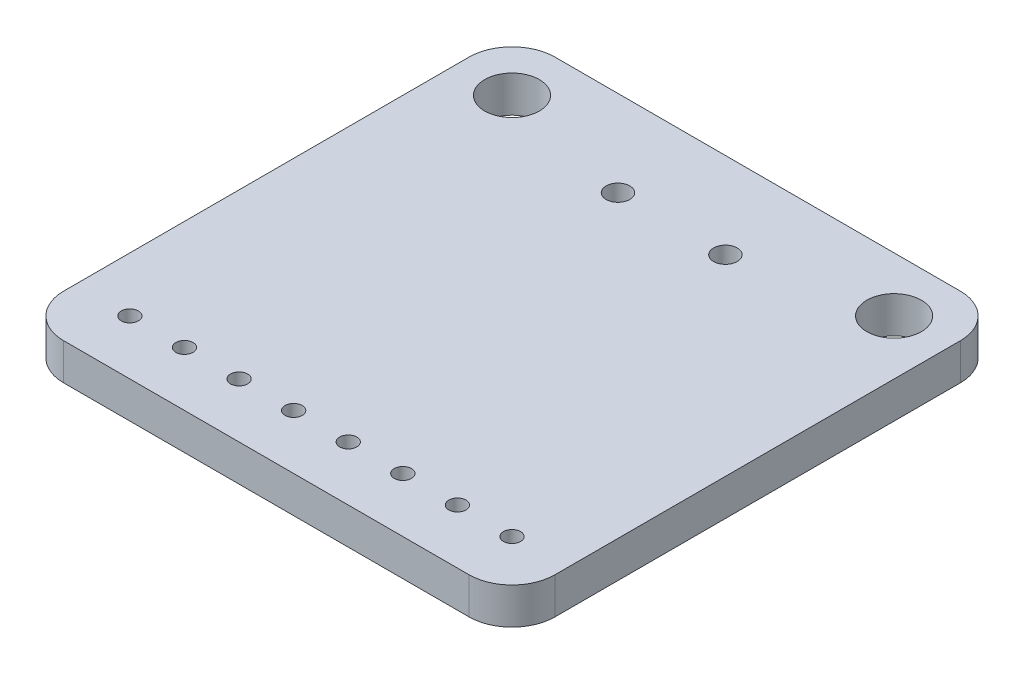
ISO-10303-21;
HEADER;
FILE_DESCRIPTION(('STEP AP214'),'2;1');
FILE_NAME('part.step','',(''),(''),'','','');
FILE_SCHEMA(('AUTOMOTIVE_DESIGN { 1 0 10303 214 1 1 1 1 }'));
ENDSEC;
DATA;
#1=APPLICATION_CONTEXT('core data for automotive mechanical design processes');
#2=APPLICATION_PROTOCOL_DEFINITION('international standard','automotive_design',2000,#1);
#3=PRODUCT_CONTEXT('',#1,'mechanical');
#4=PRODUCT('Part','Part','',(#3));
#5=PRODUCT_RELATED_PRODUCT_CATEGORY('part','',(#4));
#6=PRODUCT_DEFINITION_FORMATION('','',#4);
#7=PRODUCT_DEFINITION_CONTEXT('part definition',#1,'design');
#8=PRODUCT_DEFINITION('design','',#6,#7);
#9=PRODUCT_DEFINITION_SHAPE('','',#8);
#10=(LENGTH_UNIT() NAMED_UNIT(*) SI_UNIT(.MILLI.,.METRE.));
#11=(NAMED_UNIT(*) PLANE_ANGLE_UNIT() SI_UNIT($,.RADIAN.));
#12=(NAMED_UNIT(*) SI_UNIT($,.STERADIAN.) SOLID_ANGLE_UNIT());
#13=UNCERTAINTY_MEASURE_WITH_UNIT(LENGTH_MEASURE(1.E-05),#10,'distance_accuracy_value','');
#14=(GEOMETRIC_REPRESENTATION_CONTEXT(3) GLOBAL_UNCERTAINTY_ASSIGNED_CONTEXT((#13)) GLOBAL_UNIT_ASSIGNED_CONTEXT((#10,
#11,#12)) REPRESENTATION_CONTEXT('',''));
#15=CARTESIAN_POINT('',(0.,0.,0.));
#16=DIRECTION('',(0.,0.,1.));
#17=DIRECTION('',(1.,0.,0.));
#18=AXIS2_PLACEMENT_3D('',#15,#16,#17);
#19=CARTESIAN_POINT('',(10.247636636005,0.,0.512357787518));
#20=DIRECTION('',(0.,1.,0.));
#21=DIRECTION('',(1.,0.,0.));
#22=AXIS2_PLACEMENT_3D('',#19,#20,#21);
#23=PLANE('',#22);
#24=CARTESIAN_POINT('',(8.977636636005,0.,9.402357787519));
#25=DIRECTION('',(0.,1.,0.));
#26=DIRECTION('',(1.,0.,0.));
#27=AXIS2_PLACEMENT_3D('',#24,#25,#26);
#28=CIRCLE('',#27,0.4);
#29=CARTESIAN_POINT('',(9.377636636005,0.,9.402357787519));
#30=VERTEX_POINT('',#29);
#31=EDGE_CURVE('E197',#30,#30,#28,.T.);
#32=ORIENTED_EDGE('',*,*,#31,.T.);
#33=EDGE_LOOP('',(#32));
#34=FACE_BOUND('',#33,.T.);
#35=CARTESIAN_POINT('',(14.057636636005,0.,9.402357787519));
#36=DIRECTION('',(0.,1.,0.));
#37=DIRECTION('',(1.,0.,0.));
#38=AXIS2_PLACEMENT_3D('',#35,#36,#37);
#39=CIRCLE('',#38,0.4);
#40=CARTESIAN_POINT('',(14.457636636005,0.,9.402357787519));
#41=VERTEX_POINT('',#40);
#42=EDGE_CURVE('E207',#41,#41,#39,.T.);
#43=ORIENTED_EDGE('',*,*,#42,.T.);
#44=EDGE_LOOP('',(#43));
#45=FACE_BOUND('',#44,.T.);
#46=CARTESIAN_POINT('',(12.747636636005,0.,-6.917642212482));
#47=DIRECTION('',(0.,1.,0.));
#48=DIRECTION('',(1.,0.,0.));
#49=AXIS2_PLACEMENT_3D('',#46,#47,#48);
#50=CIRCLE('',#49,0.55);
#51=CARTESIAN_POINT('',(13.297636636005,0.,-6.917642212482));
#52=VERTEX_POINT('',#51);
#53=EDGE_CURVE('E233',#52,#52,#50,.T.);
#54=ORIENTED_EDGE('',*,*,#53,.T.);
#55=EDGE_LOOP('',(#54));
#56=FACE_BOUND('',#55,.T.);
#57=CARTESIAN_POINT('',(16.597636636005,0.,9.402357787519));
#58=DIRECTION('',(0.,1.,0.));
#59=DIRECTION('',(1.,0.,0.));
#60=AXIS2_PLACEMENT_3D('',#57,#58,#59);
#61=CIRCLE('',#60,0.4);
#62=CARTESIAN_POINT('',(16.997636636005,0.,9.402357787519));
#63=VERTEX_POINT('',#62);
#64=EDGE_CURVE('E221',#63,#63,#61,.T.);
#65=ORIENTED_EDGE('',*,*,#64,.T.);
#66=EDGE_LOOP('',(#65));
#67=FACE_BOUND('',#66,.T.);
#68=CARTESIAN_POINT('',(3.897636636005,0.,9.402357787519));
#69=DIRECTION('',(0.,1.,0.));
#70=DIRECTION('',(1.,0.,0.));
#71=AXIS2_PLACEMENT_3D('',#68,#69,#70);
#72=CIRCLE('',#71,0.4);
#73=CARTESIAN_POINT('',(4.297636636005,0.,9.402357787519));
#74=VERTEX_POINT('',#73);
#75=EDGE_CURVE('E220',#74,#74,#72,.T.);
#76=ORIENTED_EDGE('',*,*,#75,.T.);
#77=EDGE_LOOP('',(#76));
#78=FACE_BOUND('',#77,.T.);
#79=CARTESIAN_POINT('',(6.437636636005,0.,9.402357787519));
#80=DIRECTION('',(0.,1.,0.));
#81=DIRECTION('',(1.,0.,0.));
#82=AXIS2_PLACEMENT_3D('',#79,#80,#81);
#83=CIRCLE('',#82,0.4);
#84=CARTESIAN_POINT('',(6.837636636005,0.,9.402357787519));
#85=VERTEX_POINT('',#84);
#86=EDGE_CURVE('E216',#85,#85,#83,.T.);
#87=ORIENTED_EDGE('',*,*,#86,.T.);
#88=EDGE_LOOP('',(#87));
#89=FACE_BOUND('',#88,.T.);
#90=CARTESIAN_POINT('',(19.137636636005,0.,-8.377642212482));
#91=DIRECTION('',(0.,1.,0.));
#92=DIRECTION('',(1.,0.,0.));
#93=AXIS2_PLACEMENT_3D('',#90,#91,#92);
#94=CIRCLE('',#93,1.27);
#95=CARTESIAN_POINT('',(20.407636636005,0.,-8.377642212482));
#96=VERTEX_POINT('',#95);
#97=EDGE_CURVE('E215',#96,#96,#94,.T.);
#98=ORIENTED_EDGE('',*,*,#97,.T.);
#99=EDGE_LOOP('',(#98));
#100=FACE_BOUND('',#99,.T.);
#101=CARTESIAN_POINT('',(1.357636636005,0.,-8.377642212482));
#102=DIRECTION('',(0.,1.,0.));
#103=DIRECTION('',(1.,0.,0.));
#104=AXIS2_PLACEMENT_3D('',#101,#102,#103);
#105=CIRCLE('',#104,1.27);
#106=CARTESIAN_POINT('',(2.627636636005,0.,-8.377642212482));
#107=VERTEX_POINT('',#106);
#108=EDGE_CURVE('E211',#107,#107,#105,.T.);
#109=ORIENTED_EDGE('',*,*,#108,.T.);
#110=EDGE_LOOP('',(#109));
#111=FACE_BOUND('',#110,.T.);
#112=CARTESIAN_POINT('',(11.517636636005,0.,9.402357787519));
#113=DIRECTION('',(0.,1.,0.));
#114=DIRECTION('',(1.,0.,0.));
#115=AXIS2_PLACEMENT_3D('',#112,#113,#114);
#116=CIRCLE('',#115,0.4);
#117=CARTESIAN_POINT('',(11.917636636005,0.,9.402357787519));
#118=VERTEX_POINT('',#117);
#119=EDGE_CURVE('E247',#118,#118,#116,.T.);
#120=ORIENTED_EDGE('',*,*,#119,.T.);
#121=EDGE_LOOP('',(#120));
#122=FACE_BOUND('',#121,.T.);
#123=CARTESIAN_POINT('',(19.137636636005,0.,9.402357787519));
#124=DIRECTION('',(0.,1.,0.));
#125=DIRECTION('',(1.,0.,0.));
#126=AXIS2_PLACEMENT_3D('',#123,#124,#125);
#127=CIRCLE('',#126,0.4);
#128=CARTESIAN_POINT('',(19.537636636005,0.,9.402357787519));
#129=VERTEX_POINT('',#128);
#130=EDGE_CURVE('E246',#129,#129,#127,.T.);
#131=ORIENTED_EDGE('',*,*,#130,.T.);
#132=EDGE_LOOP('',(#131));
#133=FACE_BOUND('',#132,.T.);
#134=CARTESIAN_POINT('',(1.357636636005,0.,9.402357787519));
#135=DIRECTION('',(0.,1.,0.));
#136=DIRECTION('',(1.,0.,0.));
#137=AXIS2_PLACEMENT_3D('',#134,#135,#136);
#138=CIRCLE('',#137,0.4);
#139=CARTESIAN_POINT('',(1.757636636005,0.,9.402357787519));
#140=VERTEX_POINT('',#139);
#141=EDGE_CURVE('E291',#140,#140,#138,.T.);
#142=ORIENTED_EDGE('',*,*,#141,.T.);
#143=EDGE_LOOP('',(#142));
#144=FACE_BOUND('',#143,.T.);
#145=CARTESIAN_POINT('',(7.747636636005,0.,-6.917642212482));
#146=DIRECTION('',(0.,1.,0.));
#147=DIRECTION('',(1.,0.,0.));
#148=AXIS2_PLACEMENT_3D('',#145,#146,#147);
#149=CIRCLE('',#148,0.55);
#150=CARTESIAN_POINT('',(8.297636636005,0.,-6.917642212482));
#151=VERTEX_POINT('',#150);
#152=EDGE_CURVE('E272',#151,#151,#149,.T.);
#153=ORIENTED_EDGE('',*,*,#152,.T.);
#154=EDGE_LOOP('',(#153));
#155=FACE_BOUND('',#154,.T.);
#156=CARTESIAN_POINT('',(0.817636636009,0.,-8.917642212479));
#157=DIRECTION('',(0.,-1.,0.));
#158=DIRECTION('',(0.,0.,-1.));
#159=AXIS2_PLACEMENT_3D('',#156,#157,#158);
#160=CIRCLE('',#159,2.000000000003);
#161=CARTESIAN_POINT('',(-1.182363363994,0.,-8.917642212479));
#162=VERTEX_POINT('',#161);
#163=CARTESIAN_POINT('',(0.817636636009,0.,-10.91764221248));
#164=VERTEX_POINT('',#163);
#165=EDGE_CURVE('E11',#162,#164,#160,.T.);
#166=ORIENTED_EDGE('',*,*,#165,.T.);
#167=DIRECTION('',(1.,0.,0.));
#168=VECTOR('',#167,1.);
#169=CARTESIAN_POINT('',(0.817636636009,0.,-10.91764221248));
#170=LINE('',#169,#168);
#171=CARTESIAN_POINT('',(19.677636636006,0.,-10.91764221248));
#172=VERTEX_POINT('',#171);
#173=EDGE_CURVE('E345',#164,#172,#170,.T.);
#174=ORIENTED_EDGE('',*,*,#173,.T.);
#175=CARTESIAN_POINT('',(19.677636636004,0.,-8.917642212482));
#176=DIRECTION('',(0.,-1.,0.));
#177=DIRECTION('',(1.,0.,0.));
#178=AXIS2_PLACEMENT_3D('',#175,#176,#177);
#179=CIRCLE('',#178,2.);
#180=CARTESIAN_POINT('',(21.677636636004,0.,-8.917642212482));
#181=VERTEX_POINT('',#180);
#182=EDGE_CURVE('E262',#172,#181,#179,.T.);
#183=ORIENTED_EDGE('',*,*,#182,.T.);
#184=DIRECTION('',(0.,0.,1.));
#185=VECTOR('',#184,1.);
#186=CARTESIAN_POINT('',(21.677636636004,0.,-8.917642212482));
#187=LINE('',#186,#185);
#188=CARTESIAN_POINT('',(21.677636636004,0.,9.942357787519));
#189=VERTEX_POINT('',#188);
#190=EDGE_CURVE('E239',#181,#189,#187,.T.);
#191=ORIENTED_EDGE('',*,*,#190,.T.);
#192=CARTESIAN_POINT('',(19.677636636005,0.,9.942357787519));
#193=DIRECTION('',(0.,-1.,0.));
#194=DIRECTION('',(0.,0.,1.));
#195=AXIS2_PLACEMENT_3D('',#192,#193,#194);
#196=CIRCLE('',#195,1.999999999999);
#197=CARTESIAN_POINT('',(19.677636636005,0.,11.942357787518));
#198=VERTEX_POINT('',#197);
#199=EDGE_CURVE('E297',#189,#198,#196,.T.);
#200=ORIENTED_EDGE('',*,*,#199,.T.);
#201=DIRECTION('',(-1.,0.,0.));
#202=VECTOR('',#201,1.);
#203=CARTESIAN_POINT('',(19.677636636005,0.,11.942357787518));
#204=LINE('',#203,#202);
#205=CARTESIAN_POINT('',(0.817636636006,0.,11.942357787518));
#206=VERTEX_POINT('',#205);
#207=EDGE_CURVE('E324',#198,#206,#204,.T.);
#208=ORIENTED_EDGE('',*,*,#207,.T.);
#209=CARTESIAN_POINT('',(0.817636636006,0.,9.942357787518));
#210=DIRECTION('',(0.,-1.,0.));
#211=DIRECTION('',(-1.,0.,0.));
#212=AXIS2_PLACEMENT_3D('',#209,#210,#211);
#213=CIRCLE('',#212,2.);
#214=CARTESIAN_POINT('',(-1.182363363994,0.,9.942357787518));
#215=VERTEX_POINT('',#214);
#216=EDGE_CURVE('E285',#206,#215,#213,.T.);
#217=ORIENTED_EDGE('',*,*,#216,.T.);
#218=DIRECTION('',(0.,0.,-1.));
#219=VECTOR('',#218,1.);
#220=CARTESIAN_POINT('',(-1.182363363994,0.,9.942357787518));
#221=LINE('',#220,#219);
#222=EDGE_CURVE('E229',#215,#162,#221,.T.);
#223=ORIENTED_EDGE('',*,*,#222,.T.);
#224=EDGE_LOOP('',(#166,#174,#183,#191,#200,#208,#217,#223));
#225=FACE_BOUND('',#224,.T.);
#226=ADVANCED_FACE('F17',(#34,#45,#56,#67,#78,#89,#100,#111,#122,#133,#144,#155,#225),#23,.F.);
#227=CARTESIAN_POINT('',(10.247636636005,1.7,0.512357787518));
#228=DIRECTION('',(0.,1.,0.));
#229=DIRECTION('',(1.,0.,0.));
#230=AXIS2_PLACEMENT_3D('',#227,#228,#229);
#231=PLANE('',#230);
#232=CARTESIAN_POINT('',(8.977636636005,1.7,9.402357787519));
#233=DIRECTION('',(0.,-1.,0.));
#234=DIRECTION('',(1.,0.,0.));
#235=AXIS2_PLACEMENT_3D('',#232,#233,#234);
#236=CIRCLE('',#235,0.4);
#237=CARTESIAN_POINT('',(9.377636636005,1.7,9.402357787519));
#238=VERTEX_POINT('',#237);
#239=EDGE_CURVE('E201',#238,#238,#236,.T.);
#240=ORIENTED_EDGE('',*,*,#239,.T.);
#241=EDGE_LOOP('',(#240));
#242=FACE_BOUND('',#241,.T.);
#243=CARTESIAN_POINT('',(14.057636636005,1.7,9.402357787519));
#244=DIRECTION('',(0.,-1.,0.));
#245=DIRECTION('',(1.,0.,0.));
#246=AXIS2_PLACEMENT_3D('',#243,#244,#245);
#247=CIRCLE('',#246,0.4);
#248=CARTESIAN_POINT('',(14.457636636005,1.7,9.402357787519));
#249=VERTEX_POINT('',#248);
#250=EDGE_CURVE('E224',#249,#249,#247,.T.);
#251=ORIENTED_EDGE('',*,*,#250,.T.);
#252=EDGE_LOOP('',(#251));
#253=FACE_BOUND('',#252,.T.);
#254=CARTESIAN_POINT('',(12.747636636005,1.7,-6.917642212482));
#255=DIRECTION('',(0.,-1.,0.));
#256=DIRECTION('',(1.,0.,0.));
#257=AXIS2_PLACEMENT_3D('',#254,#255,#256);
#258=CIRCLE('',#257,0.55);
#259=CARTESIAN_POINT('',(13.297636636005,1.7,-6.917642212482));
#260=VERTEX_POINT('',#259);
#261=EDGE_CURVE('E250',#260,#260,#258,.T.);
#262=ORIENTED_EDGE('',*,*,#261,.T.);
#263=EDGE_LOOP('',(#262));
#264=FACE_BOUND('',#263,.T.);
#265=CARTESIAN_POINT('',(16.597636636005,1.7,9.402357787519));
#266=DIRECTION('',(0.,-1.,0.));
#267=DIRECTION('',(1.,0.,0.));
#268=AXIS2_PLACEMENT_3D('',#265,#266,#267);
#269=CIRCLE('',#268,0.4);
#270=CARTESIAN_POINT('',(16.997636636005,1.7,9.402357787519));
#271=VERTEX_POINT('',#270);
#272=EDGE_CURVE('E217',#271,#271,#269,.T.);
#273=ORIENTED_EDGE('',*,*,#272,.T.);
#274=EDGE_LOOP('',(#273));
#275=FACE_BOUND('',#274,.T.);
#276=CARTESIAN_POINT('',(3.897636636005,1.7,9.402357787519));
#277=DIRECTION('',(0.,-1.,0.));
#278=DIRECTION('',(1.,0.,0.));
#279=AXIS2_PLACEMENT_3D('',#276,#277,#278);
#280=CIRCLE('',#279,0.4);
#281=CARTESIAN_POINT('',(4.297636636005,1.7,9.402357787519));
#282=VERTEX_POINT('',#281);
#283=EDGE_CURVE('E242',#282,#282,#280,.T.);
#284=ORIENTED_EDGE('',*,*,#283,.T.);
#285=EDGE_LOOP('',(#284));
#286=FACE_BOUND('',#285,.T.);
#287=CARTESIAN_POINT('',(6.437636636005,1.7,9.402357787519));
#288=DIRECTION('',(0.,-1.,0.));
#289=DIRECTION('',(1.,0.,0.));
#290=AXIS2_PLACEMENT_3D('',#287,#288,#289);
#291=CIRCLE('',#290,0.4);
#292=CARTESIAN_POINT('',(6.837636636005,1.7,9.402357787519));
#293=VERTEX_POINT('',#292);
#294=EDGE_CURVE('E212',#293,#293,#291,.T.);
#295=ORIENTED_EDGE('',*,*,#294,.T.);
#296=EDGE_LOOP('',(#295));
#297=FACE_BOUND('',#296,.T.);
#298=CARTESIAN_POINT('',(19.137636636005,1.7,-8.377642212482));
#299=DIRECTION('',(0.,-1.,0.));
#300=DIRECTION('',(1.,0.,0.));
#301=AXIS2_PLACEMENT_3D('',#298,#299,#300);
#302=CIRCLE('',#301,1.27);
#303=CARTESIAN_POINT('',(20.407636636005,1.7,-8.377642212482));
#304=VERTEX_POINT('',#303);
#305=EDGE_CURVE('E267',#304,#304,#302,.T.);
#306=ORIENTED_EDGE('',*,*,#305,.T.);
#307=EDGE_LOOP('',(#306));
#308=FACE_BOUND('',#307,.T.);
#309=CARTESIAN_POINT('',(1.357636636005,1.7,-8.377642212482));
#310=DIRECTION('',(0.,-1.,0.));
#311=DIRECTION('',(1.,0.,0.));
#312=AXIS2_PLACEMENT_3D('',#309,#310,#311);
#313=CIRCLE('',#312,1.27);
#314=CARTESIAN_POINT('',(2.627636636005,1.7,-8.377642212482));
#315=VERTEX_POINT('',#314);
#316=EDGE_CURVE('E275',#315,#315,#313,.T.);
#317=ORIENTED_EDGE('',*,*,#316,.T.);
#318=EDGE_LOOP('',(#317));
#319=FACE_BOUND('',#318,.T.);
#320=CARTESIAN_POINT('',(11.517636636005,1.7,9.402357787519));
#321=DIRECTION('',(0.,-1.,0.));
#322=DIRECTION('',(1.,0.,0.));
#323=AXIS2_PLACEMENT_3D('',#320,#321,#322);
#324=CIRCLE('',#323,0.4);
#325=CARTESIAN_POINT('',(11.917636636005,1.7,9.402357787519));
#326=VERTEX_POINT('',#325);
#327=EDGE_CURVE('E243',#326,#326,#324,.T.);
#328=ORIENTED_EDGE('',*,*,#327,.T.);
#329=EDGE_LOOP('',(#328));
#330=FACE_BOUND('',#329,.T.);
#331=CARTESIAN_POINT('',(19.137636636005,1.7,9.402357787519));
#332=DIRECTION('',(0.,-1.,0.));
#333=DIRECTION('',(1.,0.,0.));
#334=AXIS2_PLACEMENT_3D('',#331,#332,#333);
#335=CIRCLE('',#334,0.4);
#336=CARTESIAN_POINT('',(19.537636636005,1.7,9.402357787519));
#337=VERTEX_POINT('',#336);
#338=EDGE_CURVE('E288',#337,#337,#335,.T.);
#339=ORIENTED_EDGE('',*,*,#338,.T.);
#340=EDGE_LOOP('',(#339));
#341=FACE_BOUND('',#340,.T.);
#342=CARTESIAN_POINT('',(1.357636636005,1.7,9.402357787519));
#343=DIRECTION('',(0.,-1.,0.));
#344=DIRECTION('',(1.,0.,0.));
#345=AXIS2_PLACEMENT_3D('',#342,#343,#344);
#346=CIRCLE('',#345,0.4);
#347=CARTESIAN_POINT('',(1.757636636005,1.7,9.402357787519));
#348=VERTEX_POINT('',#347);
#349=EDGE_CURVE('E303',#348,#348,#346,.T.);
#350=ORIENTED_EDGE('',*,*,#349,.T.);
#351=EDGE_LOOP('',(#350));
#352=FACE_BOUND('',#351,.T.);
#353=CARTESIAN_POINT('',(7.747636636005,1.7,-6.917642212482));
#354=DIRECTION('',(0.,-1.,0.));
#355=DIRECTION('',(1.,0.,0.));
#356=AXIS2_PLACEMENT_3D('',#353,#354,#355);
#357=CIRCLE('',#356,0.55);
#358=CARTESIAN_POINT('',(8.297636636005,1.7,-6.917642212482));
#359=VERTEX_POINT('',#358);
#360=EDGE_CURVE('E268',#359,#359,#357,.T.);
#361=ORIENTED_EDGE('',*,*,#360,.T.);
#362=EDGE_LOOP('',(#361));
#363=FACE_BOUND('',#362,.T.);
#364=CARTESIAN_POINT('',(0.817636636009,1.7,-8.917642212479));
#365=DIRECTION('',(0.,1.,0.));
#366=DIRECTION('',(0.,0.,-1.));
#367=AXIS2_PLACEMENT_3D('',#364,#365,#366);
#368=CIRCLE('',#367,2.000000000003);
#369=CARTESIAN_POINT('',(0.817636636009,1.7,-10.91764221248));
#370=VERTEX_POINT('',#369);
#371=CARTESIAN_POINT('',(-1.182363363994,1.7,-8.917642212479));
#372=VERTEX_POINT('',#371);
#373=EDGE_CURVE('E20',#370,#372,#368,.T.);
#374=ORIENTED_EDGE('',*,*,#373,.T.);
#375=DIRECTION('',(0.,0.,-1.));
#376=VECTOR('',#375,1.);
#377=CARTESIAN_POINT('',(-1.182363363994,1.7,9.942357787518));
#378=LINE('',#377,#376);
#379=CARTESIAN_POINT('',(-1.182363363994,1.7,9.942357787518));
#380=VERTEX_POINT('',#379);
#381=EDGE_CURVE('E271',#380,#372,#378,.T.);
#382=ORIENTED_EDGE('',*,*,#381,.F.);
#383=CARTESIAN_POINT('',(0.817636636006,1.7,9.942357787518));
#384=DIRECTION('',(0.,1.,0.));
#385=DIRECTION('',(-1.,0.,0.));
#386=AXIS2_PLACEMENT_3D('',#383,#384,#385);
#387=CIRCLE('',#386,2.);
#388=CARTESIAN_POINT('',(0.817636636006,1.7,11.942357787518));
#389=VERTEX_POINT('',#388);
#390=EDGE_CURVE('E228',#380,#389,#387,.T.);
#391=ORIENTED_EDGE('',*,*,#390,.T.);
#392=DIRECTION('',(-1.,0.,0.));
#393=VECTOR('',#392,1.);
#394=CARTESIAN_POINT('',(19.677636636005,1.7,11.942357787518));
#395=LINE('',#394,#393);
#396=CARTESIAN_POINT('',(19.677636636005,1.7,11.942357787518));
#397=VERTEX_POINT('',#396);
#398=EDGE_CURVE('E284',#397,#389,#395,.T.);
#399=ORIENTED_EDGE('',*,*,#398,.F.);
#400=CARTESIAN_POINT('',(19.677636636005,1.7,9.942357787519));
#401=DIRECTION('',(0.,1.,0.));
#402=DIRECTION('',(0.,0.,1.));
#403=AXIS2_PLACEMENT_3D('',#400,#401,#402);
#404=CIRCLE('',#403,1.999999999999);
#405=CARTESIAN_POINT('',(21.677636636004,1.7,9.942357787519));
#406=VERTEX_POINT('',#405);
#407=EDGE_CURVE('E300',#397,#406,#404,.T.);
#408=ORIENTED_EDGE('',*,*,#407,.T.);
#409=DIRECTION('',(0.,0.,1.));
#410=VECTOR('',#409,1.);
#411=CARTESIAN_POINT('',(21.677636636004,1.7,-8.917642212482));
#412=LINE('',#411,#410);
#413=CARTESIAN_POINT('',(21.677636636004,1.7,-8.917642212482));
#414=VERTEX_POINT('',#413);
#415=EDGE_CURVE('E296',#414,#406,#412,.T.);
#416=ORIENTED_EDGE('',*,*,#415,.F.);
#417=CARTESIAN_POINT('',(19.677636636004,1.7,-8.917642212482));
#418=DIRECTION('',(0.,1.,0.));
#419=DIRECTION('',(1.,0.,0.));
#420=AXIS2_PLACEMENT_3D('',#417,#418,#419);
#421=CIRCLE('',#420,2.);
#422=CARTESIAN_POINT('',(19.677636636006,1.7,-10.91764221248));
#423=VERTEX_POINT('',#422);
#424=EDGE_CURVE('E238',#414,#423,#421,.T.);
#425=ORIENTED_EDGE('',*,*,#424,.T.);
#426=DIRECTION('',(1.,0.,0.));
#427=VECTOR('',#426,1.);
#428=CARTESIAN_POINT('',(0.817636636009,1.7,-10.91764221248));
#429=LINE('',#428,#427);
#430=EDGE_CURVE('E261',#370,#423,#429,.T.);
#431=ORIENTED_EDGE('',*,*,#430,.F.);
#432=EDGE_LOOP('',(#374,#382,#391,#399,#408,#416,#425,#431));
#433=FACE_BOUND('',#432,.T.);
#434=ADVANCED_FACE('F358',(#242,#253,#264,#275,#286,#297,#308,#319,#330,#341,#352,#363,#433),
#231,.T.);
#435=CARTESIAN_POINT('',(0.817636636009,1.7,-8.917642212479));
#436=DIRECTION('',(0.,-1.,0.));
#437=DIRECTION('',(0.,0.,-1.));
#438=AXIS2_PLACEMENT_3D('',#435,#436,#437);
#439=CYLINDRICAL_SURFACE('',#438,2.000000000003);
#440=ORIENTED_EDGE('',*,*,#373,.F.);
#441=DIRECTION('',(0.,-1.,0.));
#442=VECTOR('',#441,1.);
#443=CARTESIAN_POINT('',(0.817636636009,1.7,-10.91764221248));
#444=LINE('',#443,#442);
#445=EDGE_CURVE('E347',#370,#164,#444,.T.);
#446=ORIENTED_EDGE('',*,*,#445,.T.);
#447=ORIENTED_EDGE('',*,*,#165,.F.);
#448=DIRECTION('',(0.,-1.,0.));
#449=VECTOR('',#448,1.);
#450=CARTESIAN_POINT('',(-1.182363363994,1.7,-8.917642212479));
#451=LINE('',#450,#449);
#452=EDGE_CURVE('E311',#372,#162,#451,.T.);
#453=ORIENTED_EDGE('',*,*,#452,.F.);
#454=EDGE_LOOP('',(#440,#446,#447,#453));
#455=FACE_BOUND('',#454,.T.);
#456=ADVANCED_FACE('F359',(#455),#439,.T.);
#457=CARTESIAN_POINT('',(0.817636636009,1.7,-10.91764221248));
#458=DIRECTION('',(0.,0.,-1.));
#459=DIRECTION('',(0.,-1.,0.));
#460=AXIS2_PLACEMENT_3D('',#457,#458,#459);
#461=PLANE('',#460);
#462=ORIENTED_EDGE('',*,*,#430,.T.);
#463=DIRECTION('',(0.,-1.,0.));
#464=VECTOR('',#463,1.);
#465=CARTESIAN_POINT('',(19.677636636006,1.7,-10.91764221248));
#466=LINE('',#465,#464);
#467=EDGE_CURVE('E257',#423,#172,#466,.T.);
#468=ORIENTED_EDGE('',*,*,#467,.T.);
#469=ORIENTED_EDGE('',*,*,#173,.F.);
#470=ORIENTED_EDGE('',*,*,#445,.F.);
#471=EDGE_LOOP('',(#462,#468,#469,#470));
#472=FACE_BOUND('',#471,.T.);
#473=ADVANCED_FACE('F387',(#472),#461,.T.);
#474=CARTESIAN_POINT('',(19.677636636004,1.7,-8.917642212482));
#475=DIRECTION('',(0.,-1.,0.));
#476=DIRECTION('',(1.,0.,0.));
#477=AXIS2_PLACEMENT_3D('',#474,#475,#476);
#478=CYLINDRICAL_SURFACE('',#477,2.);
#479=ORIENTED_EDGE('',*,*,#424,.F.);
#480=DIRECTION('',(0.,-1.,0.));
#481=VECTOR('',#480,1.);
#482=CARTESIAN_POINT('',(21.677636636004,1.7,-8.917642212482));
#483=LINE('',#482,#481);
#484=EDGE_CURVE('E234',#414,#181,#483,.T.);
#485=ORIENTED_EDGE('',*,*,#484,.T.);
#486=ORIENTED_EDGE('',*,*,#182,.F.);
#487=ORIENTED_EDGE('',*,*,#467,.F.);
#488=EDGE_LOOP('',(#479,#485,#486,#487));
#489=FACE_BOUND('',#488,.T.);
#490=ADVANCED_FACE('F384',(#489),#478,.T.);
#491=CARTESIAN_POINT('',(21.677636636004,1.7,-8.917642212482));
#492=DIRECTION('',(1.,0.,0.));
#493=DIRECTION('',(0.,1.,0.));
#494=AXIS2_PLACEMENT_3D('',#491,#492,#493);
#495=PLANE('',#494);
#496=ORIENTED_EDGE('',*,*,#415,.T.);
#497=DIRECTION('',(0.,-1.,0.));
#498=VECTOR('',#497,1.);
#499=CARTESIAN_POINT('',(21.677636636004,1.7,9.942357787519));
#500=LINE('',#499,#498);
#501=EDGE_CURVE('E292',#406,#189,#500,.T.);
#502=ORIENTED_EDGE('',*,*,#501,.T.);
#503=ORIENTED_EDGE('',*,*,#190,.F.);
#504=ORIENTED_EDGE('',*,*,#484,.F.);
#505=EDGE_LOOP('',(#496,#502,#503,#504));
#506=FACE_BOUND('',#505,.T.);
#507=ADVANCED_FACE('F380',(#506),#495,.T.);
#508=CARTESIAN_POINT('',(19.677636636005,1.7,9.942357787519));
#509=DIRECTION('',(0.,-1.,0.));
#510=DIRECTION('',(0.,0.,1.));
#511=AXIS2_PLACEMENT_3D('',#508,#509,#510);
#512=CYLINDRICAL_SURFACE('',#511,1.999999999999);
#513=ORIENTED_EDGE('',*,*,#407,.F.);
#514=DIRECTION('',(0.,-1.,0.));
#515=VECTOR('',#514,1.);
#516=CARTESIAN_POINT('',(19.677636636005,1.7,11.942357787518));
#517=LINE('',#516,#515);
#518=EDGE_CURVE('E327',#397,#198,#517,.T.);
#519=ORIENTED_EDGE('',*,*,#518,.T.);
#520=ORIENTED_EDGE('',*,*,#199,.F.);
#521=ORIENTED_EDGE('',*,*,#501,.F.);
#522=EDGE_LOOP('',(#513,#519,#520,#521));
#523=FACE_BOUND('',#522,.T.);
#524=ADVANCED_FACE('F376',(#523),#512,.T.);
#525=CARTESIAN_POINT('',(19.677636636005,1.7,11.942357787518));
#526=DIRECTION('',(0.,0.,1.));
#527=DIRECTION('',(1.,0.,0.));
#528=AXIS2_PLACEMENT_3D('',#525,#526,#527);
#529=PLANE('',#528);
#530=ORIENTED_EDGE('',*,*,#398,.T.);
#531=DIRECTION('',(0.,-1.,0.));
#532=VECTOR('',#531,1.);
#533=CARTESIAN_POINT('',(0.817636636006,1.7,11.942357787518));
#534=LINE('',#533,#532);
#535=EDGE_CURVE('E280',#389,#206,#534,.T.);
#536=ORIENTED_EDGE('',*,*,#535,.T.);
#537=ORIENTED_EDGE('',*,*,#207,.F.);
#538=ORIENTED_EDGE('',*,*,#518,.F.);
#539=EDGE_LOOP('',(#530,#536,#537,#538));
#540=FACE_BOUND('',#539,.T.);
#541=ADVANCED_FACE('F372',(#540),#529,.T.);
#542=CARTESIAN_POINT('',(0.817636636006,1.7,9.942357787518));
#543=DIRECTION('',(0.,-1.,0.));
#544=DIRECTION('',(-1.,0.,0.));
#545=AXIS2_PLACEMENT_3D('',#542,#543,#544);
#546=CYLINDRICAL_SURFACE('',#545,2.);
#547=ORIENTED_EDGE('',*,*,#390,.F.);
#548=DIRECTION('',(0.,-1.,0.));
#549=VECTOR('',#548,1.);
#550=CARTESIAN_POINT('',(-1.182363363994,1.7,9.942357787518));
#551=LINE('',#550,#549);
#552=EDGE_CURVE('E225',#380,#215,#551,.T.);
#553=ORIENTED_EDGE('',*,*,#552,.T.);
#554=ORIENTED_EDGE('',*,*,#216,.F.);
#555=ORIENTED_EDGE('',*,*,#535,.F.);
#556=EDGE_LOOP('',(#547,#553,#554,#555));
#557=FACE_BOUND('',#556,.T.);
#558=ADVANCED_FACE('F366',(#557),#546,.T.);
#559=CARTESIAN_POINT('',(-1.182363363994,1.7,9.942357787518));
#560=DIRECTION('',(-1.,0.,0.));
#561=DIRECTION('',(0.,0.,1.));
#562=AXIS2_PLACEMENT_3D('',#559,#560,#561);
#563=PLANE('',#562);
#564=ORIENTED_EDGE('',*,*,#381,.T.);
#565=ORIENTED_EDGE('',*,*,#452,.T.);
#566=ORIENTED_EDGE('',*,*,#222,.F.);
#567=ORIENTED_EDGE('',*,*,#552,.F.);
#568=EDGE_LOOP('',(#564,#565,#566,#567));
#569=FACE_BOUND('',#568,.T.);
#570=ADVANCED_FACE('F363',(#569),#563,.T.);
#571=CARTESIAN_POINT('',(7.747636636005,1.7,-6.917642212482));
#572=DIRECTION('',(0.,-1.,0.));
#573=DIRECTION('',(1.,0.,0.));
#574=AXIS2_PLACEMENT_3D('',#571,#572,#573);
#575=CYLINDRICAL_SURFACE('',#574,0.55);
#576=ORIENTED_EDGE('',*,*,#360,.F.);
#577=EDGE_LOOP('',(#576));
#578=FACE_BOUND('',#577,.T.);
#579=ORIENTED_EDGE('',*,*,#152,.F.);
#580=EDGE_LOOP('',(#579));
#581=FACE_BOUND('',#580,.T.);
#582=ADVANCED_FACE('F422',(#578,#581),#575,.F.);
#583=CARTESIAN_POINT('',(1.357636636005,1.7,9.402357787519));
#584=DIRECTION('',(0.,-1.,0.));
#585=DIRECTION('',(1.,0.,0.));
#586=AXIS2_PLACEMENT_3D('',#583,#584,#585);
#587=CYLINDRICAL_SURFACE('',#586,0.4);
#588=ORIENTED_EDGE('',*,*,#349,.F.);
#589=EDGE_LOOP('',(#588));
#590=FACE_BOUND('',#589,.T.);
#591=ORIENTED_EDGE('',*,*,#141,.F.);
#592=EDGE_LOOP('',(#591));
#593=FACE_BOUND('',#592,.T.);
#594=ADVANCED_FACE('F412',(#590,#593),#587,.F.);
#595=CARTESIAN_POINT('',(19.137636636005,1.7,9.402357787519));
#596=DIRECTION('',(0.,-1.,0.));
#597=DIRECTION('',(1.,0.,0.));
#598=AXIS2_PLACEMENT_3D('',#595,#596,#597);
#599=CYLINDRICAL_SURFACE('',#598,0.4);
#600=ORIENTED_EDGE('',*,*,#338,.F.);
#601=EDGE_LOOP('',(#600));
#602=FACE_BOUND('',#601,.T.);
#603=ORIENTED_EDGE('',*,*,#130,.F.);
#604=EDGE_LOOP('',(#603));
#605=FACE_BOUND('',#604,.T.);
#606=ADVANCED_FACE('F408',(#602,#605),#599,.F.);
#607=CARTESIAN_POINT('',(11.517636636005,1.7,9.402357787519));
#608=DIRECTION('',(0.,-1.,0.));
#609=DIRECTION('',(1.,0.,0.));
#610=AXIS2_PLACEMENT_3D('',#607,#608,#609);
#611=CYLINDRICAL_SURFACE('',#610,0.4);
#612=ORIENTED_EDGE('',*,*,#327,.F.);
#613=EDGE_LOOP('',(#612));
#614=FACE_BOUND('',#613,.T.);
#615=ORIENTED_EDGE('',*,*,#119,.F.);
#616=EDGE_LOOP('',(#615));
#617=FACE_BOUND('',#616,.T.);
#618=ADVANCED_FACE('F411',(#614,#617),#611,.F.);
#619=CARTESIAN_POINT('',(1.357636636005,1.7,-8.377642212482));
#620=DIRECTION('',(0.,-1.,0.));
#621=DIRECTION('',(1.,0.,0.));
#622=AXIS2_PLACEMENT_3D('',#619,#620,#621);
#623=CYLINDRICAL_SURFACE('',#622,1.27);
#624=ORIENTED_EDGE('',*,*,#316,.F.);
#625=EDGE_LOOP('',(#624));
#626=FACE_BOUND('',#625,.T.);
#627=ORIENTED_EDGE('',*,*,#108,.F.);
#628=EDGE_LOOP('',(#627));
#629=FACE_BOUND('',#628,.T.);
#630=ADVANCED_FACE('F420',(#626,#629),#623,.F.);
#631=CARTESIAN_POINT('',(19.137636636005,1.7,-8.377642212482));
#632=DIRECTION('',(0.,-1.,0.));
#633=DIRECTION('',(1.,0.,0.));
#634=AXIS2_PLACEMENT_3D('',#631,#632,#633);
#635=CYLINDRICAL_SURFACE('',#634,1.27);
#636=ORIENTED_EDGE('',*,*,#305,.F.);
#637=EDGE_LOOP('',(#636));
#638=FACE_BOUND('',#637,.T.);
#639=ORIENTED_EDGE('',*,*,#97,.F.);
#640=EDGE_LOOP('',(#639));
#641=FACE_BOUND('',#640,.T.);
#642=ADVANCED_FACE('F416',(#638,#641),#635,.F.);
#643=CARTESIAN_POINT('',(6.437636636005,1.7,9.402357787519));
#644=DIRECTION('',(0.,-1.,0.));
#645=DIRECTION('',(1.,0.,0.));
#646=AXIS2_PLACEMENT_3D('',#643,#644,#645);
#647=CYLINDRICAL_SURFACE('',#646,0.4);
#648=ORIENTED_EDGE('',*,*,#294,.F.);
#649=EDGE_LOOP('',(#648));
#650=FACE_BOUND('',#649,.T.);
#651=ORIENTED_EDGE('',*,*,#86,.F.);
#652=EDGE_LOOP('',(#651));
#653=FACE_BOUND('',#652,.T.);
#654=ADVANCED_FACE('F419',(#650,#653),#647,.F.);
#655=CARTESIAN_POINT('',(3.897636636005,1.7,9.402357787519));
#656=DIRECTION('',(0.,-1.,0.));
#657=DIRECTION('',(1.,0.,0.));
#658=AXIS2_PLACEMENT_3D('',#655,#656,#657);
#659=CYLINDRICAL_SURFACE('',#658,0.4);
#660=ORIENTED_EDGE('',*,*,#283,.F.);
#661=EDGE_LOOP('',(#660));
#662=FACE_BOUND('',#661,.T.);
#663=ORIENTED_EDGE('',*,*,#75,.F.);
#664=EDGE_LOOP('',(#663));
#665=FACE_BOUND('',#664,.T.);
#666=ADVANCED_FACE('F428',(#662,#665),#659,.F.);
#667=CARTESIAN_POINT('',(16.597636636005,1.7,9.402357787519));
#668=DIRECTION('',(0.,-1.,0.));
#669=DIRECTION('',(1.,0.,0.));
#670=AXIS2_PLACEMENT_3D('',#667,#668,#669);
#671=CYLINDRICAL_SURFACE('',#670,0.4);
#672=ORIENTED_EDGE('',*,*,#272,.F.);
#673=EDGE_LOOP('',(#672));
#674=FACE_BOUND('',#673,.T.);
#675=ORIENTED_EDGE('',*,*,#64,.F.);
#676=EDGE_LOOP('',(#675));
#677=FACE_BOUND('',#676,.T.);
#678=ADVANCED_FACE('F435',(#674,#677),#671,.F.);
#679=CARTESIAN_POINT('',(12.747636636005,1.7,-6.917642212482));
#680=DIRECTION('',(0.,-1.,0.));
#681=DIRECTION('',(1.,0.,0.));
#682=AXIS2_PLACEMENT_3D('',#679,#680,#681);
#683=CYLINDRICAL_SURFACE('',#682,0.55);
#684=ORIENTED_EDGE('',*,*,#261,.F.);
#685=EDGE_LOOP('',(#684));
#686=FACE_BOUND('',#685,.T.);
#687=ORIENTED_EDGE('',*,*,#53,.F.);
#688=EDGE_LOOP('',(#687));
#689=FACE_BOUND('',#688,.T.);
#690=ADVANCED_FACE('F442',(#686,#689),#683,.F.);
#691=CARTESIAN_POINT('',(14.057636636005,1.7,9.402357787519));
#692=DIRECTION('',(0.,-1.,0.));
#693=DIRECTION('',(1.,0.,0.));
#694=AXIS2_PLACEMENT_3D('',#691,#692,#693);
#695=CYLINDRICAL_SURFACE('',#694,0.4);
#696=ORIENTED_EDGE('',*,*,#250,.F.);
#697=EDGE_LOOP('',(#696));
#698=FACE_BOUND('',#697,.T.);
#699=ORIENTED_EDGE('',*,*,#42,.F.);
#700=EDGE_LOOP('',(#699));
#701=FACE_BOUND('',#700,.T.);
#702=ADVANCED_FACE('F448',(#698,#701),#695,.F.);
#703=CARTESIAN_POINT('',(8.977636636005,1.7,9.402357787519));
#704=DIRECTION('',(0.,-1.,0.));
#705=DIRECTION('',(1.,0.,0.));
#706=AXIS2_PLACEMENT_3D('',#703,#704,#705);
#707=CYLINDRICAL_SURFACE('',#706,0.4);
#708=ORIENTED_EDGE('',*,*,#239,.F.);
#709=EDGE_LOOP('',(#708));
#710=FACE_BOUND('',#709,.T.);
#711=ORIENTED_EDGE('',*,*,#31,.F.);
#712=EDGE_LOOP('',(#711));
#713=FACE_BOUND('',#712,.T.);
#714=ADVANCED_FACE('F457',(#710,#713),#707,.F.);
#715=CLOSED_SHELL('',(#226,#434,#456,#473,#490,#507,#524,#541,#558,#570,#582,#594,#606,#618,
#630,#642,#654,#666,#678,#690,#702,#714));
#716=MANIFOLD_SOLID_BREP('B1',#715);
#717=ADVANCED_BREP_SHAPE_REPRESENTATION('',(#18,#716),#14);
#718=SHAPE_DEFINITION_REPRESENTATION(#9,#717);
ENDSEC;
END-ISO-10303-21;
